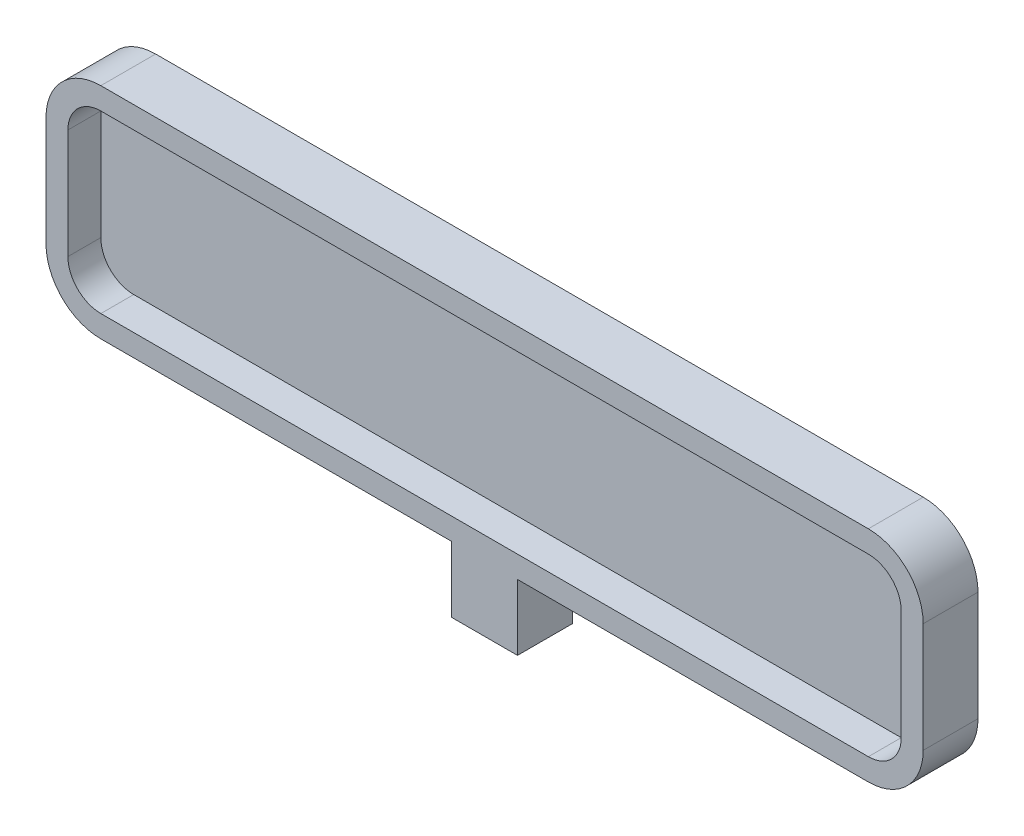
ISO-10303-21;
HEADER;
FILE_DESCRIPTION(('STEP AP214'),'2;1');
FILE_NAME('part.step','',(''),(''),'','','');
FILE_SCHEMA(('AUTOMOTIVE_DESIGN { 1 0 10303 214 1 1 1 1 }'));
ENDSEC;
DATA;
#1=APPLICATION_CONTEXT('core data for automotive mechanical design processes');
#2=APPLICATION_PROTOCOL_DEFINITION('international standard','automotive_design',2000,#1);
#3=PRODUCT_CONTEXT('',#1,'mechanical');
#4=PRODUCT('Part','Part','',(#3));
#5=PRODUCT_RELATED_PRODUCT_CATEGORY('part','',(#4));
#6=PRODUCT_DEFINITION_FORMATION('','',#4);
#7=PRODUCT_DEFINITION_CONTEXT('part definition',#1,'design');
#8=PRODUCT_DEFINITION('design','',#6,#7);
#9=PRODUCT_DEFINITION_SHAPE('','',#8);
#10=(LENGTH_UNIT() NAMED_UNIT(*) SI_UNIT(.MILLI.,.METRE.));
#11=(NAMED_UNIT(*) PLANE_ANGLE_UNIT() SI_UNIT($,.RADIAN.));
#12=(NAMED_UNIT(*) SI_UNIT($,.STERADIAN.) SOLID_ANGLE_UNIT());
#13=UNCERTAINTY_MEASURE_WITH_UNIT(LENGTH_MEASURE(1.E-05),#10,'distance_accuracy_value','');
#14=(GEOMETRIC_REPRESENTATION_CONTEXT(3) GLOBAL_UNCERTAINTY_ASSIGNED_CONTEXT((#13)) GLOBAL_UNIT_ASSIGNED_CONTEXT((#10,
#11,#12)) REPRESENTATION_CONTEXT('',''));
#15=CARTESIAN_POINT('',(0.,0.,0.));
#16=DIRECTION('',(0.,0.,1.));
#17=DIRECTION('',(1.,0.,0.));
#18=AXIS2_PLACEMENT_3D('',#15,#16,#17);
#19=CARTESIAN_POINT('',(40.,-10.,5.));
#20=DIRECTION('',(0.,1.,0.));
#21=DIRECTION('',(-1.,0.,0.));
#22=AXIS2_PLACEMENT_3D('',#19,#20,#21);
#23=PLANE('',#22);
#24=DIRECTION('',(0.,0.,-1.));
#25=VECTOR('',#24,1.);
#26=CARTESIAN_POINT('',(-2.99999999999999,-10.,0.));
#27=LINE('',#26,#25);
#28=CARTESIAN_POINT('',(-3.,-10.,5.));
#29=VERTEX_POINT('',#28);
#30=CARTESIAN_POINT('',(-3.,-10.,0.));
#31=VERTEX_POINT('',#30);
#32=EDGE_CURVE('E63',#29,#31,#27,.T.);
#33=ORIENTED_EDGE('',*,*,#32,.F.);
#34=DIRECTION('',(1.,0.,0.));
#35=VECTOR('',#34,1.);
#36=CARTESIAN_POINT('',(40.,-10.,5.));
#37=LINE('',#36,#35);
#38=CARTESIAN_POINT('',(-35.,-10.,5.));
#39=VERTEX_POINT('',#38);
#40=EDGE_CURVE('E301',#39,#29,#37,.T.);
#41=ORIENTED_EDGE('',*,*,#40,.F.);
#42=DIRECTION('',(0.,0.,-1.));
#43=VECTOR('',#42,1.);
#44=CARTESIAN_POINT('',(-35.,-10.,5.));
#45=LINE('',#44,#43);
#46=CARTESIAN_POINT('',(-35.,-10.,0.));
#47=VERTEX_POINT('',#46);
#48=EDGE_CURVE('E365',#39,#47,#45,.T.);
#49=ORIENTED_EDGE('',*,*,#48,.T.);
#50=DIRECTION('',(1.,0.,0.));
#51=VECTOR('',#50,1.);
#52=CARTESIAN_POINT('',(40.,-10.,0.));
#53=LINE('',#52,#51);
#54=EDGE_CURVE('E317',#47,#31,#53,.T.);
#55=ORIENTED_EDGE('',*,*,#54,.T.);
#56=EDGE_LOOP('',(#33,#41,#49,#55));
#57=FACE_BOUND('',#56,.T.);
#58=ADVANCED_FACE('F39',(#57),#23,.F.);
#59=DIRECTION('',(0.,0.,1.));
#60=VECTOR('',#59,1.);
#61=CARTESIAN_POINT('',(3.,-10.,0.));
#62=LINE('',#61,#60);
#63=CARTESIAN_POINT('',(3.,-10.,0.));
#64=VERTEX_POINT('',#63);
#65=CARTESIAN_POINT('',(3.,-10.,5.));
#66=VERTEX_POINT('',#65);
#67=EDGE_CURVE('E201',#64,#66,#62,.T.);
#68=ORIENTED_EDGE('',*,*,#67,.F.);
#69=CARTESIAN_POINT('',(35.,-10.,0.));
#70=VERTEX_POINT('',#69);
#71=EDGE_CURVE('E316',#64,#70,#53,.T.);
#72=ORIENTED_EDGE('',*,*,#71,.T.);
#73=DIRECTION('',(0.,0.,-1.));
#74=VECTOR('',#73,1.);
#75=CARTESIAN_POINT('',(35.,-10.,5.));
#76=LINE('',#75,#74);
#77=CARTESIAN_POINT('',(35.,-10.,5.));
#78=VERTEX_POINT('',#77);
#79=EDGE_CURVE('E369',#70,#78,#76,.F.);
#80=ORIENTED_EDGE('',*,*,#79,.T.);
#81=EDGE_CURVE('E55',#66,#78,#37,.T.);
#82=ORIENTED_EDGE('',*,*,#81,.F.);
#83=EDGE_LOOP('',(#68,#72,#80,#82));
#84=FACE_BOUND('',#83,.T.);
#85=ADVANCED_FACE('F427',(#84),#23,.F.);
#86=CARTESIAN_POINT('',(-40.,-10.,5.));
#87=DIRECTION('',(1.,0.,0.));
#88=DIRECTION('',(0.,0.,-1.));
#89=AXIS2_PLACEMENT_3D('',#86,#87,#88);
#90=PLANE('',#89);
#91=DIRECTION('',(0.,-1.,0.));
#92=VECTOR('',#91,1.);
#93=CARTESIAN_POINT('',(-40.,-10.,0.));
#94=LINE('',#93,#92);
#95=CARTESIAN_POINT('',(-40.,5.,0.));
#96=VERTEX_POINT('',#95);
#97=CARTESIAN_POINT('',(-40.,-5.,0.));
#98=VERTEX_POINT('',#97);
#99=EDGE_CURVE('E219',#96,#98,#94,.T.);
#100=ORIENTED_EDGE('',*,*,#99,.T.);
#101=DIRECTION('',(0.,0.,-1.));
#102=VECTOR('',#101,1.);
#103=CARTESIAN_POINT('',(-40.,-5.,5.));
#104=LINE('',#103,#102);
#105=CARTESIAN_POINT('',(-40.,-5.,5.));
#106=VERTEX_POINT('',#105);
#107=EDGE_CURVE('E11',#98,#106,#104,.F.);
#108=ORIENTED_EDGE('',*,*,#107,.T.);
#109=DIRECTION('',(0.,-1.,0.));
#110=VECTOR('',#109,1.);
#111=CARTESIAN_POINT('',(-40.,-10.,5.));
#112=LINE('',#111,#110);
#113=CARTESIAN_POINT('',(-40.,5.,5.));
#114=VERTEX_POINT('',#113);
#115=EDGE_CURVE('E296',#114,#106,#112,.T.);
#116=ORIENTED_EDGE('',*,*,#115,.F.);
#117=DIRECTION('',(0.,0.,-1.));
#118=VECTOR('',#117,1.);
#119=CARTESIAN_POINT('',(-40.,5.,5.));
#120=LINE('',#119,#118);
#121=EDGE_CURVE('E48',#114,#96,#120,.T.);
#122=ORIENTED_EDGE('',*,*,#121,.T.);
#123=EDGE_LOOP('',(#100,#108,#116,#122));
#124=FACE_BOUND('',#123,.T.);
#125=ADVANCED_FACE('F377',(#124),#90,.F.);
#126=CARTESIAN_POINT('',(40.,-10.,5.));
#127=DIRECTION('',(-1.,0.,0.));
#128=DIRECTION('',(0.,0.,1.));
#129=AXIS2_PLACEMENT_3D('',#126,#127,#128);
#130=PLANE('',#129);
#131=DIRECTION('',(0.,1.,0.));
#132=VECTOR('',#131,1.);
#133=CARTESIAN_POINT('',(40.,-10.,0.));
#134=LINE('',#133,#132);
#135=CARTESIAN_POINT('',(40.,-5.,0.));
#136=VERTEX_POINT('',#135);
#137=CARTESIAN_POINT('',(40.,5.,0.));
#138=VERTEX_POINT('',#137);
#139=EDGE_CURVE('E320',#136,#138,#134,.T.);
#140=ORIENTED_EDGE('',*,*,#139,.T.);
#141=DIRECTION('',(0.,0.,-1.));
#142=VECTOR('',#141,1.);
#143=CARTESIAN_POINT('',(40.,5.,5.));
#144=LINE('',#143,#142);
#145=CARTESIAN_POINT('',(40.,5.,5.));
#146=VERTEX_POINT('',#145);
#147=EDGE_CURVE('E350',#138,#146,#144,.F.);
#148=ORIENTED_EDGE('',*,*,#147,.T.);
#149=DIRECTION('',(0.,1.,0.));
#150=VECTOR('',#149,1.);
#151=CARTESIAN_POINT('',(40.,-10.,5.));
#152=LINE('',#151,#150);
#153=CARTESIAN_POINT('',(40.,-5.,5.));
#154=VERTEX_POINT('',#153);
#155=EDGE_CURVE('E304',#154,#146,#152,.T.);
#156=ORIENTED_EDGE('',*,*,#155,.F.);
#157=DIRECTION('',(0.,0.,-1.));
#158=VECTOR('',#157,1.);
#159=CARTESIAN_POINT('',(40.,-5.,5.));
#160=LINE('',#159,#158);
#161=EDGE_CURVE('E346',#154,#136,#160,.T.);
#162=ORIENTED_EDGE('',*,*,#161,.T.);
#163=EDGE_LOOP('',(#140,#148,#156,#162));
#164=FACE_BOUND('',#163,.T.);
#165=ADVANCED_FACE('F434',(#164),#130,.F.);
#166=CARTESIAN_POINT('',(40.,10.,5.));
#167=DIRECTION('',(0.,-1.,0.));
#168=DIRECTION('',(1.,0.,0.));
#169=AXIS2_PLACEMENT_3D('',#166,#167,#168);
#170=PLANE('',#169);
#171=DIRECTION('',(-1.,0.,0.));
#172=VECTOR('',#171,1.);
#173=CARTESIAN_POINT('',(40.,10.,5.));
#174=LINE('',#173,#172);
#175=CARTESIAN_POINT('',(35.,10.,5.));
#176=VERTEX_POINT('',#175);
#177=CARTESIAN_POINT('',(-35.,10.,5.));
#178=VERTEX_POINT('',#177);
#179=EDGE_CURVE('E308',#176,#178,#174,.T.);
#180=ORIENTED_EDGE('',*,*,#179,.F.);
#181=DIRECTION('',(0.,0.,-1.));
#182=VECTOR('',#181,1.);
#183=CARTESIAN_POINT('',(35.,10.,5.));
#184=LINE('',#183,#182);
#185=CARTESIAN_POINT('',(35.,10.,0.));
#186=VERTEX_POINT('',#185);
#187=EDGE_CURVE('E329',#176,#186,#184,.T.);
#188=ORIENTED_EDGE('',*,*,#187,.T.);
#189=DIRECTION('',(-1.,0.,0.));
#190=VECTOR('',#189,1.);
#191=CARTESIAN_POINT('',(40.,10.,0.));
#192=LINE('',#191,#190);
#193=CARTESIAN_POINT('',(-35.,10.,0.));
#194=VERTEX_POINT('',#193);
#195=EDGE_CURVE('E300',#186,#194,#192,.T.);
#196=ORIENTED_EDGE('',*,*,#195,.T.);
#197=DIRECTION('',(0.,0.,-1.));
#198=VECTOR('',#197,1.);
#199=CARTESIAN_POINT('',(-35.,10.,5.));
#200=LINE('',#199,#198);
#201=EDGE_CURVE('E312',#194,#178,#200,.F.);
#202=ORIENTED_EDGE('',*,*,#201,.T.);
#203=EDGE_LOOP('',(#180,#188,#196,#202));
#204=FACE_BOUND('',#203,.T.);
#205=ADVANCED_FACE('F461',(#204),#170,.F.);
#206=CARTESIAN_POINT('',(0.,0.,5.));
#207=DIRECTION('',(0.,0.,1.));
#208=DIRECTION('',(1.,0.,0.));
#209=AXIS2_PLACEMENT_3D('',#206,#207,#208);
#210=PLANE('',#209);
#211=DIRECTION('',(0.,1.,0.));
#212=VECTOR('',#211,1.);
#213=CARTESIAN_POINT('',(38.,-10.,5.));
#214=LINE('',#213,#212);
#215=CARTESIAN_POINT('',(38.,-5.,5.));
#216=VERTEX_POINT('',#215);
#217=CARTESIAN_POINT('',(38.,5.,5.));
#218=VERTEX_POINT('',#217);
#219=EDGE_CURVE('E283',#216,#218,#214,.T.);
#220=ORIENTED_EDGE('',*,*,#219,.F.);
#221=CARTESIAN_POINT('',(35.,-5.,5.));
#222=DIRECTION('',(0.,0.,1.));
#223=DIRECTION('',(1.,0.,0.));
#224=AXIS2_PLACEMENT_3D('',#221,#222,#223);
#225=CIRCLE('',#224,3.);
#226=CARTESIAN_POINT('',(35.,-8.,5.));
#227=VERTEX_POINT('',#226);
#228=EDGE_CURVE('E280',#227,#216,#225,.T.);
#229=ORIENTED_EDGE('',*,*,#228,.F.);
#230=DIRECTION('',(1.,0.,0.));
#231=VECTOR('',#230,1.);
#232=CARTESIAN_POINT('',(40.,-8.,5.));
#233=LINE('',#232,#231);
#234=CARTESIAN_POINT('',(-35.,-8.,5.));
#235=VERTEX_POINT('',#234);
#236=EDGE_CURVE('E276',#235,#227,#233,.T.);
#237=ORIENTED_EDGE('',*,*,#236,.F.);
#238=CARTESIAN_POINT('',(-35.,-5.,5.));
#239=DIRECTION('',(0.,0.,1.));
#240=DIRECTION('',(1.,0.,0.));
#241=AXIS2_PLACEMENT_3D('',#238,#239,#240);
#242=CIRCLE('',#241,3.);
#243=CARTESIAN_POINT('',(-38.,-5.,5.));
#244=VERTEX_POINT('',#243);
#245=EDGE_CURVE('E277',#244,#235,#242,.T.);
#246=ORIENTED_EDGE('',*,*,#245,.F.);
#247=DIRECTION('',(0.,-1.,0.));
#248=VECTOR('',#247,1.);
#249=CARTESIAN_POINT('',(-38.,-10.,5.));
#250=LINE('',#249,#248);
#251=CARTESIAN_POINT('',(-38.,5.,5.));
#252=VERTEX_POINT('',#251);
#253=EDGE_CURVE('E229',#252,#244,#250,.T.);
#254=ORIENTED_EDGE('',*,*,#253,.F.);
#255=CARTESIAN_POINT('',(-35.,5.,5.));
#256=DIRECTION('',(0.,0.,1.));
#257=DIRECTION('',(1.,0.,0.));
#258=AXIS2_PLACEMENT_3D('',#255,#256,#257);
#259=CIRCLE('',#258,3.);
#260=CARTESIAN_POINT('',(-35.,8.,5.));
#261=VERTEX_POINT('',#260);
#262=EDGE_CURVE('E265',#261,#252,#259,.T.);
#263=ORIENTED_EDGE('',*,*,#262,.F.);
#264=DIRECTION('',(-1.,0.,0.));
#265=VECTOR('',#264,1.);
#266=CARTESIAN_POINT('',(40.,8.,5.));
#267=LINE('',#266,#265);
#268=CARTESIAN_POINT('',(35.,8.,5.));
#269=VERTEX_POINT('',#268);
#270=EDGE_CURVE('E272',#269,#261,#267,.T.);
#271=ORIENTED_EDGE('',*,*,#270,.F.);
#272=CARTESIAN_POINT('',(35.,5.,5.));
#273=DIRECTION('',(0.,0.,1.));
#274=DIRECTION('',(1.,0.,0.));
#275=AXIS2_PLACEMENT_3D('',#272,#273,#274);
#276=CIRCLE('',#275,3.);
#277=EDGE_CURVE('E258',#218,#269,#276,.T.);
#278=ORIENTED_EDGE('',*,*,#277,.F.);
#279=EDGE_LOOP('',(#220,#229,#237,#246,#254,#263,#271,#278));
#280=FACE_BOUND('',#279,.T.);
#281=ORIENTED_EDGE('',*,*,#155,.T.);
#282=CARTESIAN_POINT('',(35.,5.,5.));
#283=DIRECTION('',(0.,0.,1.));
#284=DIRECTION('',(1.,0.,0.));
#285=AXIS2_PLACEMENT_3D('',#282,#283,#284);
#286=CIRCLE('',#285,5.);
#287=EDGE_CURVE('E362',#146,#176,#286,.T.);
#288=ORIENTED_EDGE('',*,*,#287,.T.);
#289=ORIENTED_EDGE('',*,*,#179,.T.);
#290=CARTESIAN_POINT('',(-35.,5.,5.));
#291=DIRECTION('',(0.,0.,1.));
#292=DIRECTION('',(1.,0.,0.));
#293=AXIS2_PLACEMENT_3D('',#290,#291,#292);
#294=CIRCLE('',#293,5.);
#295=EDGE_CURVE('E353',#178,#114,#294,.T.);
#296=ORIENTED_EDGE('',*,*,#295,.T.);
#297=ORIENTED_EDGE('',*,*,#115,.T.);
#298=CARTESIAN_POINT('',(-35.,-5.,5.));
#299=DIRECTION('',(0.,0.,1.));
#300=DIRECTION('',(1.,0.,0.));
#301=AXIS2_PLACEMENT_3D('',#298,#299,#300);
#302=CIRCLE('',#301,5.);
#303=EDGE_CURVE('E356',#106,#39,#302,.T.);
#304=ORIENTED_EDGE('',*,*,#303,.T.);
#305=ORIENTED_EDGE('',*,*,#40,.T.);
#306=DIRECTION('',(0.,1.,0.));
#307=VECTOR('',#306,1.);
#308=CARTESIAN_POINT('',(-2.99999999999999,-16.,5.));
#309=LINE('',#308,#307);
#310=CARTESIAN_POINT('',(-2.99999999999999,-16.,5.));
#311=VERTEX_POINT('',#310);
#312=EDGE_CURVE('E387',#311,#29,#309,.T.);
#313=ORIENTED_EDGE('',*,*,#312,.F.);
#314=DIRECTION('',(-1.,0.,0.));
#315=VECTOR('',#314,1.);
#316=CARTESIAN_POINT('',(-2.99999999999999,-16.,5.));
#317=LINE('',#316,#315);
#318=CARTESIAN_POINT('',(3.00000000000001,-16.,5.));
#319=VERTEX_POINT('',#318);
#320=EDGE_CURVE('E196',#319,#311,#317,.T.);
#321=ORIENTED_EDGE('',*,*,#320,.F.);
#322=DIRECTION('',(0.,1.,0.));
#323=VECTOR('',#322,1.);
#324=CARTESIAN_POINT('',(3.00000000000001,-16.,5.));
#325=LINE('',#324,#323);
#326=EDGE_CURVE('E212',#319,#66,#325,.T.);
#327=ORIENTED_EDGE('',*,*,#326,.T.);
#328=ORIENTED_EDGE('',*,*,#81,.T.);
#329=CARTESIAN_POINT('',(35.,-5.,5.));
#330=DIRECTION('',(0.,0.,1.));
#331=DIRECTION('',(1.,0.,0.));
#332=AXIS2_PLACEMENT_3D('',#329,#330,#331);
#333=CIRCLE('',#332,5.);
#334=EDGE_CURVE('E359',#78,#154,#333,.T.);
#335=ORIENTED_EDGE('',*,*,#334,.T.);
#336=EDGE_LOOP('',(#281,#288,#289,#296,#297,#304,#305,#313,#321,#327,#328,#335));
#337=FACE_BOUND('',#336,.T.);
#338=ADVANCED_FACE('F386',(#280,#337),#210,.T.);
#339=CARTESIAN_POINT('',(0.,0.,0.));
#340=DIRECTION('',(0.,0.,1.));
#341=DIRECTION('',(1.,0.,0.));
#342=AXIS2_PLACEMENT_3D('',#339,#340,#341);
#343=PLANE('',#342);
#344=ORIENTED_EDGE('',*,*,#195,.F.);
#345=CARTESIAN_POINT('',(35.,5.,0.));
#346=DIRECTION('',(0.,0.,1.));
#347=DIRECTION('',(1.,0.,0.));
#348=AXIS2_PLACEMENT_3D('',#345,#346,#347);
#349=CIRCLE('',#348,5.);
#350=EDGE_CURVE('E343',#186,#138,#349,.F.);
#351=ORIENTED_EDGE('',*,*,#350,.T.);
#352=ORIENTED_EDGE('',*,*,#139,.F.);
#353=CARTESIAN_POINT('',(35.,-5.,0.));
#354=DIRECTION('',(0.,0.,1.));
#355=DIRECTION('',(1.,0.,0.));
#356=AXIS2_PLACEMENT_3D('',#353,#354,#355);
#357=CIRCLE('',#356,5.);
#358=EDGE_CURVE('E339',#136,#70,#357,.F.);
#359=ORIENTED_EDGE('',*,*,#358,.T.);
#360=ORIENTED_EDGE('',*,*,#71,.F.);
#361=DIRECTION('',(0.,1.,0.));
#362=VECTOR('',#361,1.);
#363=CARTESIAN_POINT('',(3.,-16.,0.));
#364=LINE('',#363,#362);
#365=CARTESIAN_POINT('',(3.,-16.,0.));
#366=VERTEX_POINT('',#365);
#367=EDGE_CURVE('E186',#366,#64,#364,.T.);
#368=ORIENTED_EDGE('',*,*,#367,.F.);
#369=DIRECTION('',(1.,0.,0.));
#370=VECTOR('',#369,1.);
#371=CARTESIAN_POINT('',(-2.99999999999999,-16.,0.));
#372=LINE('',#371,#370);
#373=CARTESIAN_POINT('',(-2.99999999999999,-16.,0.));
#374=VERTEX_POINT('',#373);
#375=EDGE_CURVE('E178',#374,#366,#372,.T.);
#376=ORIENTED_EDGE('',*,*,#375,.F.);
#377=DIRECTION('',(0.,1.,0.));
#378=VECTOR('',#377,1.);
#379=CARTESIAN_POINT('',(-2.99999999999999,-16.,0.));
#380=LINE('',#379,#378);
#381=EDGE_CURVE('E184',#374,#31,#380,.T.);
#382=ORIENTED_EDGE('',*,*,#381,.T.);
#383=ORIENTED_EDGE('',*,*,#54,.F.);
#384=CARTESIAN_POINT('',(-35.,-5.,0.));
#385=DIRECTION('',(0.,0.,1.));
#386=DIRECTION('',(1.,0.,0.));
#387=AXIS2_PLACEMENT_3D('',#384,#385,#386);
#388=CIRCLE('',#387,5.);
#389=EDGE_CURVE('E336',#47,#98,#388,.F.);
#390=ORIENTED_EDGE('',*,*,#389,.T.);
#391=ORIENTED_EDGE('',*,*,#99,.F.);
#392=CARTESIAN_POINT('',(-35.,5.,0.));
#393=DIRECTION('',(0.,0.,1.));
#394=DIRECTION('',(1.,0.,0.));
#395=AXIS2_PLACEMENT_3D('',#392,#393,#394);
#396=CIRCLE('',#395,5.);
#397=EDGE_CURVE('E333',#96,#194,#396,.F.);
#398=ORIENTED_EDGE('',*,*,#397,.T.);
#399=EDGE_LOOP('',(#344,#351,#352,#359,#360,#368,#376,#382,#383,#390,#391,#398));
#400=FACE_BOUND('',#399,.T.);
#401=ADVANCED_FACE('F181',(#400),#343,.F.);
#402=CARTESIAN_POINT('',(35.,5.,5.));
#403=DIRECTION('',(0.,0.,-1.));
#404=DIRECTION('',(-1.,0.,0.));
#405=AXIS2_PLACEMENT_3D('',#402,#403,#404);
#406=CYLINDRICAL_SURFACE('',#405,5.);
#407=ORIENTED_EDGE('',*,*,#287,.F.);
#408=ORIENTED_EDGE('',*,*,#147,.F.);
#409=ORIENTED_EDGE('',*,*,#350,.F.);
#410=ORIENTED_EDGE('',*,*,#187,.F.);
#411=EDGE_LOOP('',(#407,#408,#409,#410));
#412=FACE_BOUND('',#411,.T.);
#413=ADVANCED_FACE('F438',(#412),#406,.T.);
#414=CARTESIAN_POINT('',(35.,-5.,5.));
#415=DIRECTION('',(0.,0.,-1.));
#416=DIRECTION('',(-1.,0.,0.));
#417=AXIS2_PLACEMENT_3D('',#414,#415,#416);
#418=CYLINDRICAL_SURFACE('',#417,5.);
#419=ORIENTED_EDGE('',*,*,#334,.F.);
#420=ORIENTED_EDGE('',*,*,#79,.F.);
#421=ORIENTED_EDGE('',*,*,#358,.F.);
#422=ORIENTED_EDGE('',*,*,#161,.F.);
#423=EDGE_LOOP('',(#419,#420,#421,#422));
#424=FACE_BOUND('',#423,.T.);
#425=ADVANCED_FACE('F441',(#424),#418,.T.);
#426=CARTESIAN_POINT('',(-35.,-5.,5.));
#427=DIRECTION('',(0.,0.,-1.));
#428=DIRECTION('',(-1.,0.,0.));
#429=AXIS2_PLACEMENT_3D('',#426,#427,#428);
#430=CYLINDRICAL_SURFACE('',#429,5.);
#431=ORIENTED_EDGE('',*,*,#303,.F.);
#432=ORIENTED_EDGE('',*,*,#107,.F.);
#433=ORIENTED_EDGE('',*,*,#389,.F.);
#434=ORIENTED_EDGE('',*,*,#48,.F.);
#435=EDGE_LOOP('',(#431,#432,#433,#434));
#436=FACE_BOUND('',#435,.T.);
#437=ADVANCED_FACE('F384',(#436),#430,.T.);
#438=CARTESIAN_POINT('',(-35.,5.,5.));
#439=DIRECTION('',(0.,0.,-1.));
#440=DIRECTION('',(-1.,0.,0.));
#441=AXIS2_PLACEMENT_3D('',#438,#439,#440);
#442=CYLINDRICAL_SURFACE('',#441,5.);
#443=ORIENTED_EDGE('',*,*,#295,.F.);
#444=ORIENTED_EDGE('',*,*,#201,.F.);
#445=ORIENTED_EDGE('',*,*,#397,.F.);
#446=ORIENTED_EDGE('',*,*,#121,.F.);
#447=EDGE_LOOP('',(#443,#444,#445,#446));
#448=FACE_BOUND('',#447,.T.);
#449=ADVANCED_FACE('F41',(#448),#442,.T.);
#450=CARTESIAN_POINT('',(-38.,-10.,5.));
#451=DIRECTION('',(1.,0.,0.));
#452=DIRECTION('',(0.,0.,-1.));
#453=AXIS2_PLACEMENT_3D('',#450,#451,#452);
#454=PLANE('',#453);
#455=DIRECTION('',(0.,-1.,0.));
#456=VECTOR('',#455,1.);
#457=CARTESIAN_POINT('',(-38.,-10.,2.));
#458=LINE('',#457,#456);
#459=CARTESIAN_POINT('',(-38.,5.,2.));
#460=VERTEX_POINT('',#459);
#461=CARTESIAN_POINT('',(-38.,-5.,2.));
#462=VERTEX_POINT('',#461);
#463=EDGE_CURVE('E205',#460,#462,#458,.T.);
#464=ORIENTED_EDGE('',*,*,#463,.F.);
#465=DIRECTION('',(0.,0.,-1.));
#466=VECTOR('',#465,1.);
#467=CARTESIAN_POINT('',(-38.,5.,5.));
#468=LINE('',#467,#466);
#469=EDGE_CURVE('E220',#252,#460,#468,.T.);
#470=ORIENTED_EDGE('',*,*,#469,.F.);
#471=ORIENTED_EDGE('',*,*,#253,.T.);
#472=DIRECTION('',(0.,0.,-1.));
#473=VECTOR('',#472,1.);
#474=CARTESIAN_POINT('',(-38.,-5.,5.));
#475=LINE('',#474,#473);
#476=EDGE_CURVE('E216',#462,#244,#475,.F.);
#477=ORIENTED_EDGE('',*,*,#476,.F.);
#478=EDGE_LOOP('',(#464,#470,#471,#477));
#479=FACE_BOUND('',#478,.T.);
#480=ADVANCED_FACE('F449',(#479),#454,.T.);
#481=CARTESIAN_POINT('',(40.,-8.,5.));
#482=DIRECTION('',(0.,1.,0.));
#483=DIRECTION('',(-1.,0.,0.));
#484=AXIS2_PLACEMENT_3D('',#481,#482,#483);
#485=PLANE('',#484);
#486=DIRECTION('',(1.,0.,0.));
#487=VECTOR('',#486,1.);
#488=CARTESIAN_POINT('',(40.,-8.,2.));
#489=LINE('',#488,#487);
#490=CARTESIAN_POINT('',(-35.,-8.,2.));
#491=VERTEX_POINT('',#490);
#492=CARTESIAN_POINT('',(35.,-8.,2.));
#493=VERTEX_POINT('',#492);
#494=EDGE_CURVE('E210',#491,#493,#489,.T.);
#495=ORIENTED_EDGE('',*,*,#494,.F.);
#496=DIRECTION('',(0.,0.,1.));
#497=VECTOR('',#496,1.);
#498=CARTESIAN_POINT('',(-35.,-8.,5.));
#499=LINE('',#498,#497);
#500=EDGE_CURVE('E254',#235,#491,#499,.F.);
#501=ORIENTED_EDGE('',*,*,#500,.F.);
#502=ORIENTED_EDGE('',*,*,#236,.T.);
#503=DIRECTION('',(0.,0.,1.));
#504=VECTOR('',#503,1.);
#505=CARTESIAN_POINT('',(35.,-8.,5.));
#506=LINE('',#505,#504);
#507=EDGE_CURVE('E224',#493,#227,#506,.T.);
#508=ORIENTED_EDGE('',*,*,#507,.F.);
#509=EDGE_LOOP('',(#495,#501,#502,#508));
#510=FACE_BOUND('',#509,.T.);
#511=ADVANCED_FACE('F453',(#510),#485,.T.);
#512=CARTESIAN_POINT('',(38.,-10.,5.));
#513=DIRECTION('',(-1.,0.,0.));
#514=DIRECTION('',(0.,0.,1.));
#515=AXIS2_PLACEMENT_3D('',#512,#513,#514);
#516=PLANE('',#515);
#517=DIRECTION('',(0.,1.,0.));
#518=VECTOR('',#517,1.);
#519=CARTESIAN_POINT('',(38.,-10.,2.));
#520=LINE('',#519,#518);
#521=CARTESIAN_POINT('',(38.,-5.,2.));
#522=VERTEX_POINT('',#521);
#523=CARTESIAN_POINT('',(38.,5.,2.));
#524=VERTEX_POINT('',#523);
#525=EDGE_CURVE('E230',#522,#524,#520,.T.);
#526=ORIENTED_EDGE('',*,*,#525,.F.);
#527=DIRECTION('',(0.,0.,1.));
#528=VECTOR('',#527,1.);
#529=CARTESIAN_POINT('',(38.,-5.,5.));
#530=LINE('',#529,#528);
#531=EDGE_CURVE('E234',#216,#522,#530,.F.);
#532=ORIENTED_EDGE('',*,*,#531,.F.);
#533=ORIENTED_EDGE('',*,*,#219,.T.);
#534=DIRECTION('',(0.,0.,1.));
#535=VECTOR('',#534,1.);
#536=CARTESIAN_POINT('',(38.,5.,5.));
#537=LINE('',#536,#535);
#538=EDGE_CURVE('E262',#524,#218,#537,.T.);
#539=ORIENTED_EDGE('',*,*,#538,.F.);
#540=EDGE_LOOP('',(#526,#532,#533,#539));
#541=FACE_BOUND('',#540,.T.);
#542=ADVANCED_FACE('F507',(#541),#516,.T.);
#543=CARTESIAN_POINT('',(40.,8.,5.));
#544=DIRECTION('',(0.,-1.,0.));
#545=DIRECTION('',(1.,0.,0.));
#546=AXIS2_PLACEMENT_3D('',#543,#544,#545);
#547=PLANE('',#546);
#548=ORIENTED_EDGE('',*,*,#270,.T.);
#549=DIRECTION('',(0.,0.,1.));
#550=VECTOR('',#549,1.);
#551=CARTESIAN_POINT('',(-35.,8.,5.));
#552=LINE('',#551,#550);
#553=CARTESIAN_POINT('',(-35.,8.,2.));
#554=VERTEX_POINT('',#553);
#555=EDGE_CURVE('E269',#554,#261,#552,.T.);
#556=ORIENTED_EDGE('',*,*,#555,.F.);
#557=DIRECTION('',(-1.,0.,0.));
#558=VECTOR('',#557,1.);
#559=CARTESIAN_POINT('',(40.,8.,2.));
#560=LINE('',#559,#558);
#561=CARTESIAN_POINT('',(35.,8.,2.));
#562=VERTEX_POINT('',#561);
#563=EDGE_CURVE('E225',#562,#554,#560,.T.);
#564=ORIENTED_EDGE('',*,*,#563,.F.);
#565=DIRECTION('',(0.,0.,1.));
#566=VECTOR('',#565,1.);
#567=CARTESIAN_POINT('',(35.,8.,5.));
#568=LINE('',#567,#566);
#569=EDGE_CURVE('E250',#269,#562,#568,.F.);
#570=ORIENTED_EDGE('',*,*,#569,.F.);
#571=EDGE_LOOP('',(#548,#556,#564,#570));
#572=FACE_BOUND('',#571,.T.);
#573=ADVANCED_FACE('F503',(#572),#547,.T.);
#574=CARTESIAN_POINT('',(0.,0.,2.));
#575=DIRECTION('',(0.,0.,1.));
#576=DIRECTION('',(1.,0.,0.));
#577=AXIS2_PLACEMENT_3D('',#574,#575,#576);
#578=PLANE('',#577);
#579=ORIENTED_EDGE('',*,*,#563,.T.);
#580=CARTESIAN_POINT('',(-35.,5.,2.));
#581=DIRECTION('',(0.,0.,1.));
#582=DIRECTION('',(1.,0.,0.));
#583=AXIS2_PLACEMENT_3D('',#580,#581,#582);
#584=CIRCLE('',#583,3.);
#585=EDGE_CURVE('E247',#460,#554,#584,.F.);
#586=ORIENTED_EDGE('',*,*,#585,.F.);
#587=ORIENTED_EDGE('',*,*,#463,.T.);
#588=CARTESIAN_POINT('',(-35.,-5.,2.));
#589=DIRECTION('',(0.,0.,1.));
#590=DIRECTION('',(1.,0.,0.));
#591=AXIS2_PLACEMENT_3D('',#588,#589,#590);
#592=CIRCLE('',#591,3.);
#593=EDGE_CURVE('E241',#491,#462,#592,.F.);
#594=ORIENTED_EDGE('',*,*,#593,.F.);
#595=ORIENTED_EDGE('',*,*,#494,.T.);
#596=CARTESIAN_POINT('',(35.,-5.,2.));
#597=DIRECTION('',(0.,0.,1.));
#598=DIRECTION('',(1.,0.,0.));
#599=AXIS2_PLACEMENT_3D('',#596,#597,#598);
#600=CIRCLE('',#599,3.);
#601=EDGE_CURVE('E235',#522,#493,#600,.F.);
#602=ORIENTED_EDGE('',*,*,#601,.F.);
#603=ORIENTED_EDGE('',*,*,#525,.T.);
#604=CARTESIAN_POINT('',(35.,5.,2.));
#605=DIRECTION('',(0.,0.,1.));
#606=DIRECTION('',(1.,0.,0.));
#607=AXIS2_PLACEMENT_3D('',#604,#605,#606);
#608=CIRCLE('',#607,3.);
#609=EDGE_CURVE('E231',#562,#524,#608,.F.);
#610=ORIENTED_EDGE('',*,*,#609,.F.);
#611=EDGE_LOOP('',(#579,#586,#587,#594,#595,#602,#603,#610));
#612=FACE_BOUND('',#611,.T.);
#613=ADVANCED_FACE('F499',(#612),#578,.T.);
#614=CARTESIAN_POINT('',(35.,5.,5.));
#615=DIRECTION('',(0.,0.,-1.));
#616=DIRECTION('',(-1.,0.,0.));
#617=AXIS2_PLACEMENT_3D('',#614,#615,#616);
#618=CYLINDRICAL_SURFACE('',#617,3.);
#619=ORIENTED_EDGE('',*,*,#277,.T.);
#620=ORIENTED_EDGE('',*,*,#569,.T.);
#621=ORIENTED_EDGE('',*,*,#609,.T.);
#622=ORIENTED_EDGE('',*,*,#538,.T.);
#623=EDGE_LOOP('',(#619,#620,#621,#622));
#624=FACE_BOUND('',#623,.T.);
#625=ADVANCED_FACE('F495',(#624),#618,.F.);
#626=CARTESIAN_POINT('',(35.,-5.,5.));
#627=DIRECTION('',(0.,0.,-1.));
#628=DIRECTION('',(-1.,0.,0.));
#629=AXIS2_PLACEMENT_3D('',#626,#627,#628);
#630=CYLINDRICAL_SURFACE('',#629,3.);
#631=ORIENTED_EDGE('',*,*,#228,.T.);
#632=ORIENTED_EDGE('',*,*,#531,.T.);
#633=ORIENTED_EDGE('',*,*,#601,.T.);
#634=ORIENTED_EDGE('',*,*,#507,.T.);
#635=EDGE_LOOP('',(#631,#632,#633,#634));
#636=FACE_BOUND('',#635,.T.);
#637=ADVANCED_FACE('F491',(#636),#630,.F.);
#638=CARTESIAN_POINT('',(-35.,-5.,5.));
#639=DIRECTION('',(0.,0.,-1.));
#640=DIRECTION('',(-1.,0.,0.));
#641=AXIS2_PLACEMENT_3D('',#638,#639,#640);
#642=CYLINDRICAL_SURFACE('',#641,3.);
#643=ORIENTED_EDGE('',*,*,#245,.T.);
#644=ORIENTED_EDGE('',*,*,#500,.T.);
#645=ORIENTED_EDGE('',*,*,#593,.T.);
#646=ORIENTED_EDGE('',*,*,#476,.T.);
#647=EDGE_LOOP('',(#643,#644,#645,#646));
#648=FACE_BOUND('',#647,.T.);
#649=ADVANCED_FACE('F487',(#648),#642,.F.);
#650=CARTESIAN_POINT('',(-35.,5.,5.));
#651=DIRECTION('',(0.,0.,-1.));
#652=DIRECTION('',(-1.,0.,0.));
#653=AXIS2_PLACEMENT_3D('',#650,#651,#652);
#654=CYLINDRICAL_SURFACE('',#653,3.);
#655=ORIENTED_EDGE('',*,*,#262,.T.);
#656=ORIENTED_EDGE('',*,*,#469,.T.);
#657=ORIENTED_EDGE('',*,*,#585,.T.);
#658=ORIENTED_EDGE('',*,*,#555,.T.);
#659=EDGE_LOOP('',(#655,#656,#657,#658));
#660=FACE_BOUND('',#659,.T.);
#661=ADVANCED_FACE('F484',(#660),#654,.F.);
#662=CARTESIAN_POINT('',(-2.99999999999999,-16.,0.));
#663=DIRECTION('',(1.,0.,0.));
#664=DIRECTION('',(0.,1.,0.));
#665=AXIS2_PLACEMENT_3D('',#662,#663,#664);
#666=PLANE('',#665);
#667=ORIENTED_EDGE('',*,*,#32,.T.);
#668=ORIENTED_EDGE('',*,*,#381,.F.);
#669=DIRECTION('',(0.,0.,-1.));
#670=VECTOR('',#669,1.);
#671=CARTESIAN_POINT('',(-2.99999999999999,-16.,0.));
#672=LINE('',#671,#670);
#673=EDGE_CURVE('E191',#311,#374,#672,.T.);
#674=ORIENTED_EDGE('',*,*,#673,.F.);
#675=ORIENTED_EDGE('',*,*,#312,.T.);
#676=EDGE_LOOP('',(#667,#668,#674,#675));
#677=FACE_BOUND('',#676,.T.);
#678=ADVANCED_FACE('F203',(#677),#666,.F.);
#679=CARTESIAN_POINT('',(3.,-16.,0.));
#680=DIRECTION('',(-1.,0.,0.));
#681=DIRECTION('',(0.,0.,1.));
#682=AXIS2_PLACEMENT_3D('',#679,#680,#681);
#683=PLANE('',#682);
#684=ORIENTED_EDGE('',*,*,#67,.T.);
#685=ORIENTED_EDGE('',*,*,#326,.F.);
#686=DIRECTION('',(0.,0.,1.));
#687=VECTOR('',#686,1.);
#688=CARTESIAN_POINT('',(3.,-16.,0.));
#689=LINE('',#688,#687);
#690=EDGE_CURVE('E190',#366,#319,#689,.T.);
#691=ORIENTED_EDGE('',*,*,#690,.F.);
#692=ORIENTED_EDGE('',*,*,#367,.T.);
#693=EDGE_LOOP('',(#684,#685,#691,#692));
#694=FACE_BOUND('',#693,.T.);
#695=ADVANCED_FACE('F419',(#694),#683,.F.);
#696=CARTESIAN_POINT('',(0.,-16.,0.));
#697=DIRECTION('',(0.,1.,0.));
#698=DIRECTION('',(0.,0.,1.));
#699=AXIS2_PLACEMENT_3D('',#696,#697,#698);
#700=PLANE('',#699);
#701=CARTESIAN_POINT('',(0.,-16.,2.5));
#702=DIRECTION('',(0.,-1.,0.));
#703=DIRECTION('',(0.,0.,-1.));
#704=AXIS2_PLACEMENT_3D('',#701,#702,#703);
#705=CIRCLE('',#704,1.425);
#706=CARTESIAN_POINT('',(0.,-16.,1.075));
#707=VERTEX_POINT('',#706);
#708=EDGE_CURVE('E402',#707,#707,#705,.T.);
#709=ORIENTED_EDGE('',*,*,#708,.F.);
#710=EDGE_LOOP('',(#709));
#711=FACE_BOUND('',#710,.T.);
#712=ORIENTED_EDGE('',*,*,#673,.T.);
#713=ORIENTED_EDGE('',*,*,#375,.T.);
#714=ORIENTED_EDGE('',*,*,#690,.T.);
#715=ORIENTED_EDGE('',*,*,#320,.T.);
#716=EDGE_LOOP('',(#712,#713,#714,#715));
#717=FACE_BOUND('',#716,.T.);
#718=ADVANCED_FACE('F194',(#711,#717),#700,.F.);
#719=CARTESIAN_POINT('',(0.,-12.,2.5));
#720=DIRECTION('',(0.,-1.,0.));
#721=DIRECTION('',(0.,0.,-1.));
#722=AXIS2_PLACEMENT_3D('',#719,#720,#721);
#723=CYLINDRICAL_SURFACE('',#722,1.425);
#724=CARTESIAN_POINT('',(0.,-12.,2.5));
#725=DIRECTION('',(0.,-1.,0.));
#726=DIRECTION('',(0.,0.,-1.));
#727=AXIS2_PLACEMENT_3D('',#724,#725,#726);
#728=CIRCLE('',#727,1.425);
#729=CARTESIAN_POINT('',(0.,-12.,1.075));
#730=VERTEX_POINT('',#729);
#731=EDGE_CURVE('E398',#730,#730,#728,.T.);
#732=ORIENTED_EDGE('',*,*,#731,.F.);
#733=EDGE_LOOP('',(#732));
#734=FACE_BOUND('',#733,.T.);
#735=ORIENTED_EDGE('',*,*,#708,.T.);
#736=EDGE_LOOP('',(#735));
#737=FACE_BOUND('',#736,.T.);
#738=ADVANCED_FACE('F412',(#734,#737),#723,.F.);
#739=CARTESIAN_POINT('',(0.,-12.,2.5));
#740=DIRECTION('',(0.,-1.,0.));
#741=DIRECTION('',(0.,0.,-1.));
#742=AXIS2_PLACEMENT_3D('',#739,#740,#741);
#743=PLANE('',#742);
#744=ORIENTED_EDGE('',*,*,#731,.T.);
#745=EDGE_LOOP('',(#744));
#746=FACE_BOUND('',#745,.T.);
#747=ADVANCED_FACE('F410',(#746),#743,.T.);
#748=CLOSED_SHELL('',(#58,#85,#125,#165,#205,#338,#401,#413,#425,#437,#449,#480,#511,#542,#573,
#613,#625,#637,#649,#661,#678,#695,#718,#738,#747));
#749=MANIFOLD_SOLID_BREP('B2',#748);
#750=ADVANCED_BREP_SHAPE_REPRESENTATION('',(#18,#749),#14);
#751=SHAPE_DEFINITION_REPRESENTATION(#9,#750);
ENDSEC;
END-ISO-10303-21;
